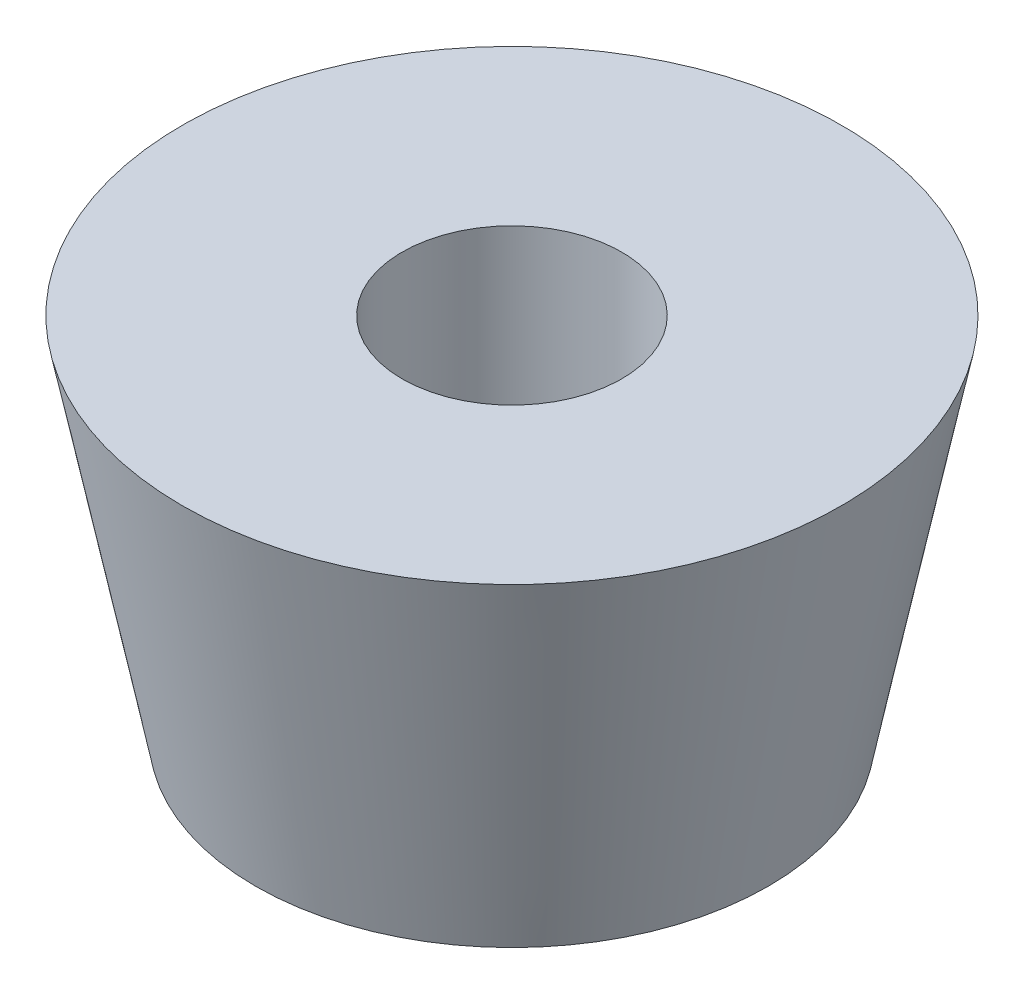
ISO-10303-21;
HEADER;
FILE_DESCRIPTION(('STEP AP214'),'2;1');
FILE_NAME('part.step','',(''),(''),'','','');
FILE_SCHEMA(('AUTOMOTIVE_DESIGN { 1 0 10303 214 1 1 1 1 }'));
ENDSEC;
DATA;
#1=APPLICATION_CONTEXT('core data for automotive mechanical design processes');
#2=APPLICATION_PROTOCOL_DEFINITION('international standard','automotive_design',2000,#1);
#3=PRODUCT_CONTEXT('',#1,'mechanical');
#4=PRODUCT('Part','Part','',(#3));
#5=PRODUCT_RELATED_PRODUCT_CATEGORY('part','',(#4));
#6=PRODUCT_DEFINITION_FORMATION('','',#4);
#7=PRODUCT_DEFINITION_CONTEXT('part definition',#1,'design');
#8=PRODUCT_DEFINITION('design','',#6,#7);
#9=PRODUCT_DEFINITION_SHAPE('','',#8);
#10=(LENGTH_UNIT() NAMED_UNIT(*) SI_UNIT(.MILLI.,.METRE.));
#11=(NAMED_UNIT(*) PLANE_ANGLE_UNIT() SI_UNIT($,.RADIAN.));
#12=(NAMED_UNIT(*) SI_UNIT($,.STERADIAN.) SOLID_ANGLE_UNIT());
#13=UNCERTAINTY_MEASURE_WITH_UNIT(LENGTH_MEASURE(1.E-05),#10,'distance_accuracy_value','');
#14=(GEOMETRIC_REPRESENTATION_CONTEXT(3) GLOBAL_UNCERTAINTY_ASSIGNED_CONTEXT((#13)) GLOBAL_UNIT_ASSIGNED_CONTEXT((#10,
#11,#12)) REPRESENTATION_CONTEXT('',''));
#15=CARTESIAN_POINT('',(0.,0.,0.));
#16=DIRECTION('',(0.,0.,1.));
#17=DIRECTION('',(1.,0.,0.));
#18=AXIS2_PLACEMENT_3D('',#15,#16,#17);
#19=CARTESIAN_POINT('',(0.,0.,-4.5));
#20=DIRECTION('',(0.,-1.,0.));
#21=DIRECTION('',(0.,0.,-1.));
#22=AXIS2_PLACEMENT_3D('',#19,#20,#21);
#23=PLANE('',#22);
#24=CARTESIAN_POINT('',(0.,0.,0.));
#25=DIRECTION('',(0.,1.,0.));
#26=DIRECTION('',(0.,0.,1.));
#27=AXIS2_PLACEMENT_3D('',#24,#25,#26);
#28=CIRCLE('',#27,1.5);
#29=CARTESIAN_POINT('',(0.,0.,1.5));
#30=VERTEX_POINT('',#29);
#31=EDGE_CURVE('E10',#30,#30,#28,.T.);
#32=ORIENTED_EDGE('',*,*,#31,.F.);
#33=EDGE_LOOP('',(#32));
#34=FACE_BOUND('',#33,.T.);
#35=CARTESIAN_POINT('',(0.,0.,0.));
#36=DIRECTION('',(0.,1.,0.));
#37=DIRECTION('',(0.,0.,1.));
#38=AXIS2_PLACEMENT_3D('',#35,#36,#37);
#39=CIRCLE('',#38,4.5);
#40=CARTESIAN_POINT('',(0.,0.,4.5));
#41=VERTEX_POINT('',#40);
#42=EDGE_CURVE('E51',#41,#41,#39,.T.);
#43=ORIENTED_EDGE('',*,*,#42,.T.);
#44=EDGE_LOOP('',(#43));
#45=FACE_BOUND('',#44,.T.);
#46=ADVANCED_FACE('F37',(#34,#45),#23,.F.);
#47=CARTESIAN_POINT('',(0.,0.,0.));
#48=DIRECTION('',(0.,1.,0.));
#49=DIRECTION('',(0.,0.,1.));
#50=AXIS2_PLACEMENT_3D('',#47,#48,#49);
#51=CYLINDRICAL_SURFACE('',#50,1.5);
#52=CARTESIAN_POINT('',(0.,-5.,0.));
#53=DIRECTION('',(0.,1.,0.));
#54=DIRECTION('',(0.,0.,1.));
#55=AXIS2_PLACEMENT_3D('',#52,#53,#54);
#56=CIRCLE('',#55,1.5);
#57=CARTESIAN_POINT('',(0.,-5.,1.5));
#58=VERTEX_POINT('',#57);
#59=EDGE_CURVE('E43',#58,#58,#56,.T.);
#60=ORIENTED_EDGE('',*,*,#59,.F.);
#61=EDGE_LOOP('',(#60));
#62=FACE_BOUND('',#61,.T.);
#63=ORIENTED_EDGE('',*,*,#31,.T.);
#64=EDGE_LOOP('',(#63));
#65=FACE_BOUND('',#64,.T.);
#66=ADVANCED_FACE('F66',(#62,#65),#51,.F.);
#67=CARTESIAN_POINT('',(0.,-5.,-1.5));
#68=DIRECTION('',(0.,1.,0.));
#69=DIRECTION('',(0.,0.,1.));
#70=AXIS2_PLACEMENT_3D('',#67,#68,#69);
#71=PLANE('',#70);
#72=CARTESIAN_POINT('',(0.,-5.,0.));
#73=DIRECTION('',(0.,1.,0.));
#74=DIRECTION('',(0.,0.,1.));
#75=AXIS2_PLACEMENT_3D('',#72,#73,#74);
#76=CIRCLE('',#75,3.5);
#77=CARTESIAN_POINT('',(0.,-5.,3.5));
#78=VERTEX_POINT('',#77);
#79=EDGE_CURVE('E47',#78,#78,#76,.T.);
#80=ORIENTED_EDGE('',*,*,#79,.F.);
#81=EDGE_LOOP('',(#80));
#82=FACE_BOUND('',#81,.T.);
#83=ORIENTED_EDGE('',*,*,#59,.T.);
#84=EDGE_LOOP('',(#83));
#85=FACE_BOUND('',#84,.T.);
#86=ADVANCED_FACE('F61',(#82,#85),#71,.F.);
#87=CARTESIAN_POINT('',(0.,-5.,0.));
#88=DIRECTION('',(0.,1.,0.));
#89=DIRECTION('',(0.,0.,1.));
#90=AXIS2_PLACEMENT_3D('',#87,#88,#89);
#91=CONICAL_SURFACE('',#90,3.5,0.197395559849881);
#92=ORIENTED_EDGE('',*,*,#42,.F.);
#93=EDGE_LOOP('',(#92));
#94=FACE_BOUND('',#93,.T.);
#95=ORIENTED_EDGE('',*,*,#79,.T.);
#96=EDGE_LOOP('',(#95));
#97=FACE_BOUND('',#96,.T.);
#98=ADVANCED_FACE('F58',(#94,#97),#91,.T.);
#99=CLOSED_SHELL('',(#46,#66,#86,#98));
#100=MANIFOLD_SOLID_BREP('B2',#99);
#101=ADVANCED_BREP_SHAPE_REPRESENTATION('',(#18,#100),#14);
#102=SHAPE_DEFINITION_REPRESENTATION(#9,#101);
ENDSEC;
END-ISO-10303-21;
